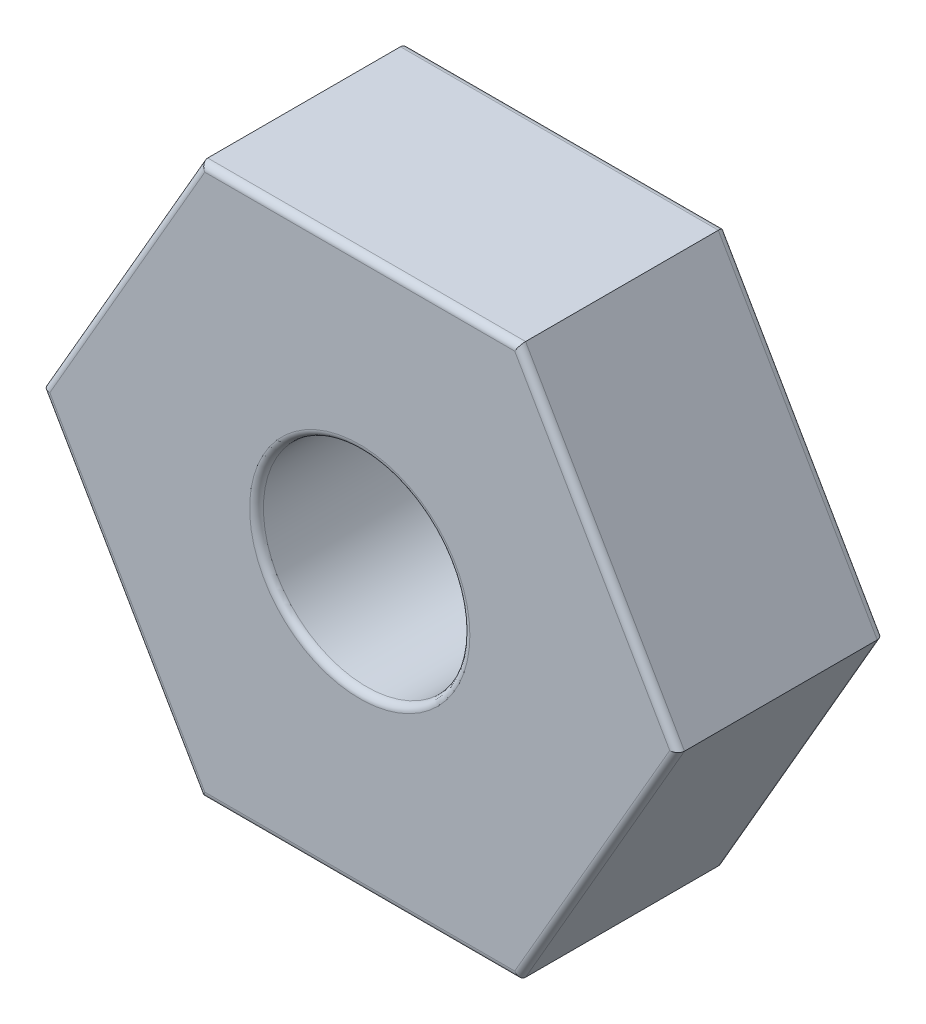
ISO-10303-21;
HEADER;
FILE_DESCRIPTION(('STEP AP214'),'2;1');
FILE_NAME('part.step','',(''),(''),'','','');
FILE_SCHEMA(('AUTOMOTIVE_DESIGN { 1 0 10303 214 1 1 1 1 }'));
ENDSEC;
DATA;
#1=APPLICATION_CONTEXT('core data for automotive mechanical design processes');
#2=APPLICATION_PROTOCOL_DEFINITION('international standard','automotive_design',2000,#1);
#3=PRODUCT_CONTEXT('',#1,'mechanical');
#4=PRODUCT('Part','Part','',(#3));
#5=PRODUCT_RELATED_PRODUCT_CATEGORY('part','',(#4));
#6=PRODUCT_DEFINITION_FORMATION('','',#4);
#7=PRODUCT_DEFINITION_CONTEXT('part definition',#1,'design');
#8=PRODUCT_DEFINITION('design','',#6,#7);
#9=PRODUCT_DEFINITION_SHAPE('','',#8);
#10=(LENGTH_UNIT() NAMED_UNIT(*) SI_UNIT(.MILLI.,.METRE.));
#11=(NAMED_UNIT(*) PLANE_ANGLE_UNIT() SI_UNIT($,.RADIAN.));
#12=(NAMED_UNIT(*) SI_UNIT($,.STERADIAN.) SOLID_ANGLE_UNIT());
#13=UNCERTAINTY_MEASURE_WITH_UNIT(LENGTH_MEASURE(1.E-05),#10,'distance_accuracy_value','');
#14=(GEOMETRIC_REPRESENTATION_CONTEXT(3) GLOBAL_UNCERTAINTY_ASSIGNED_CONTEXT((#13)) GLOBAL_UNIT_ASSIGNED_CONTEXT((#10,
#11,#12)) REPRESENTATION_CONTEXT('',''));
#15=CARTESIAN_POINT('',(0.,0.,0.));
#16=DIRECTION('',(0.,0.,1.));
#17=DIRECTION('',(1.,0.,0.));
#18=AXIS2_PLACEMENT_3D('',#15,#16,#17);
#19=CARTESIAN_POINT('',(-2.30940107675851,4.,3.));
#20=DIRECTION('',(0.,0.,1.));
#21=DIRECTION('',(1.,0.,0.));
#22=AXIS2_PLACEMENT_3D('',#19,#20,#21);
#23=PLANE('',#22);
#24=CARTESIAN_POINT('',(0.,0.,3.));
#25=DIRECTION('',(0.,0.,1.));
#26=DIRECTION('',(1.,0.,0.));
#27=AXIS2_PLACEMENT_3D('',#24,#25,#26);
#28=CIRCLE('',#27,1.6);
#29=CARTESIAN_POINT('',(1.6,0.,3.));
#30=VERTEX_POINT('',#29);
#31=EDGE_CURVE('E11',#30,#30,#28,.F.);
#32=ORIENTED_EDGE('',*,*,#31,.T.);
#33=EDGE_LOOP('',(#32));
#34=FACE_BOUND('',#33,.T.);
#35=DIRECTION('',(0.5,0.866025403784439,0.));
#36=VECTOR('',#35,1.);
#37=CARTESIAN_POINT('',(4.53219961313857,0.0500000000000022,3.));
#38=LINE('',#37,#36);
#39=CARTESIAN_POINT('',(2.25166604983954,-3.9,3.));
#40=VERTEX_POINT('',#39);
#41=CARTESIAN_POINT('',(4.50333209967908,0.,3.));
#42=VERTEX_POINT('',#41);
#43=EDGE_CURVE('E50',#40,#42,#38,.T.);
#44=ORIENTED_EDGE('',*,*,#43,.T.);
#45=DIRECTION('',(-0.5,0.866025403784439,0.));
#46=VECTOR('',#45,1.);
#47=CARTESIAN_POINT('',(2.22279853638006,3.95,3.));
#48=LINE('',#47,#46);
#49=CARTESIAN_POINT('',(2.25166604983954,3.9,3.));
#50=VERTEX_POINT('',#49);
#51=EDGE_CURVE('E42',#42,#50,#48,.T.);
#52=ORIENTED_EDGE('',*,*,#51,.T.);
#53=DIRECTION('',(-1.,0.,0.));
#54=VECTOR('',#53,1.);
#55=CARTESIAN_POINT('',(-2.30940107675851,3.9,3.));
#56=LINE('',#55,#54);
#57=CARTESIAN_POINT('',(-2.25166604983954,3.9,3.));
#58=VERTEX_POINT('',#57);
#59=EDGE_CURVE('E189',#50,#58,#56,.T.);
#60=ORIENTED_EDGE('',*,*,#59,.T.);
#61=DIRECTION('',(-0.5,-0.866025403784439,0.));
#62=VECTOR('',#61,1.);
#63=CARTESIAN_POINT('',(-4.53219961313857,-0.0500000000000032,3.));
#64=LINE('',#63,#62);
#65=CARTESIAN_POINT('',(-4.50333209967908,0.,3.));
#66=VERTEX_POINT('',#65);
#67=EDGE_CURVE('E191',#58,#66,#64,.T.);
#68=ORIENTED_EDGE('',*,*,#67,.T.);
#69=DIRECTION('',(0.5,-0.866025403784439,0.));
#70=VECTOR('',#69,1.);
#71=CARTESIAN_POINT('',(-2.22279853638006,-3.95,3.));
#72=LINE('',#71,#70);
#73=CARTESIAN_POINT('',(-2.25166604983954,-3.9,3.));
#74=VERTEX_POINT('',#73);
#75=EDGE_CURVE('E193',#66,#74,#72,.T.);
#76=ORIENTED_EDGE('',*,*,#75,.T.);
#77=DIRECTION('',(1.,0.,0.));
#78=VECTOR('',#77,1.);
#79=CARTESIAN_POINT('',(2.3094010767585,-3.9,3.));
#80=LINE('',#79,#78);
#81=EDGE_CURVE('E55',#74,#40,#80,.T.);
#82=ORIENTED_EDGE('',*,*,#81,.T.);
#83=EDGE_LOOP('',(#44,#52,#60,#68,#76,#82));
#84=FACE_BOUND('',#83,.T.);
#85=ADVANCED_FACE('F33',(#34,#84),#23,.T.);
#86=CARTESIAN_POINT('',(-2.30940107675851,4.,0.));
#87=DIRECTION('',(0.,0.,1.));
#88=DIRECTION('',(1.,0.,0.));
#89=AXIS2_PLACEMENT_3D('',#86,#87,#88);
#90=PLANE('',#89);
#91=CARTESIAN_POINT('',(0.,0.,0.));
#92=DIRECTION('',(0.,0.,1.));
#93=DIRECTION('',(1.,0.,0.));
#94=AXIS2_PLACEMENT_3D('',#91,#92,#93);
#95=CIRCLE('',#94,1.6);
#96=CARTESIAN_POINT('',(1.6,0.,0.));
#97=VERTEX_POINT('',#96);
#98=EDGE_CURVE('E151',#97,#97,#95,.T.);
#99=ORIENTED_EDGE('',*,*,#98,.T.);
#100=EDGE_LOOP('',(#99));
#101=FACE_BOUND('',#100,.T.);
#102=DIRECTION('',(0.5,-0.866025403784439,0.));
#103=VECTOR('',#102,1.);
#104=CARTESIAN_POINT('',(-5.68690015151782,2.05,0.));
#105=LINE('',#104,#103);
#106=CARTESIAN_POINT('',(-2.25166604983954,-3.9,0.));
#107=VERTEX_POINT('',#106);
#108=CARTESIAN_POINT('',(-4.50333209967908,0.,0.));
#109=VERTEX_POINT('',#108);
#110=EDGE_CURVE('E150',#107,#109,#105,.F.);
#111=ORIENTED_EDGE('',*,*,#110,.T.);
#112=DIRECTION('',(-0.5,-0.866025403784439,0.));
#113=VECTOR('',#112,1.);
#114=CARTESIAN_POINT('',(-2.22279853638006,3.95,0.));
#115=LINE('',#114,#113);
#116=CARTESIAN_POINT('',(-2.25166604983954,3.9,0.));
#117=VERTEX_POINT('',#116);
#118=EDGE_CURVE('E129',#109,#117,#115,.F.);
#119=ORIENTED_EDGE('',*,*,#118,.T.);
#120=DIRECTION('',(-1.,0.,0.));
#121=VECTOR('',#120,1.);
#122=CARTESIAN_POINT('',(-2.30940107675851,3.9,0.));
#123=LINE('',#122,#121);
#124=CARTESIAN_POINT('',(2.25166604983954,3.9,0.));
#125=VERTEX_POINT('',#124);
#126=EDGE_CURVE('E139',#117,#125,#123,.F.);
#127=ORIENTED_EDGE('',*,*,#126,.T.);
#128=DIRECTION('',(-0.5,0.866025403784439,0.));
#129=VECTOR('',#128,1.);
#130=CARTESIAN_POINT('',(1.06809799800081,5.95,0.));
#131=LINE('',#130,#129);
#132=CARTESIAN_POINT('',(4.50333209967908,0.,0.));
#133=VERTEX_POINT('',#132);
#134=EDGE_CURVE('E145',#125,#133,#131,.F.);
#135=ORIENTED_EDGE('',*,*,#134,.T.);
#136=DIRECTION('',(0.5,0.866025403784439,0.));
#137=VECTOR('',#136,1.);
#138=CARTESIAN_POINT('',(4.53219961313856,0.0500000000000006,0.));
#139=LINE('',#138,#137);
#140=CARTESIAN_POINT('',(2.25166604983954,-3.9,0.));
#141=VERTEX_POINT('',#140);
#142=EDGE_CURVE('E251',#133,#141,#139,.F.);
#143=ORIENTED_EDGE('',*,*,#142,.T.);
#144=DIRECTION('',(1.,0.,0.));
#145=VECTOR('',#144,1.);
#146=CARTESIAN_POINT('',(-2.3094010767585,-3.9,0.));
#147=LINE('',#146,#145);
#148=EDGE_CURVE('E156',#141,#107,#147,.F.);
#149=ORIENTED_EDGE('',*,*,#148,.T.);
#150=EDGE_LOOP('',(#111,#119,#127,#135,#143,#149));
#151=FACE_BOUND('',#150,.T.);
#152=ADVANCED_FACE('F148',(#101,#151),#90,.F.);
#153=CARTESIAN_POINT('',(2.3094010767585,4.,3.));
#154=DIRECTION('',(0.,-1.,0.));
#155=DIRECTION('',(1.,0.,0.));
#156=AXIS2_PLACEMENT_3D('',#153,#154,#155);
#157=PLANE('',#156);
#158=DIRECTION('',(0.,0.,-1.));
#159=VECTOR('',#158,1.);
#160=CARTESIAN_POINT('',(2.3094010767585,4.,3.));
#161=LINE('',#160,#159);
#162=CARTESIAN_POINT('',(2.3094010767585,4.,2.9));
#163=VERTEX_POINT('',#162);
#164=CARTESIAN_POINT('',(2.3094010767585,4.,0.1));
#165=VERTEX_POINT('',#164);
#166=EDGE_CURVE('E208',#163,#165,#161,.T.);
#167=ORIENTED_EDGE('',*,*,#166,.T.);
#168=DIRECTION('',(-1.,0.,0.));
#169=VECTOR('',#168,1.);
#170=CARTESIAN_POINT('',(2.3094010767585,4.,0.0999999999999998));
#171=LINE('',#170,#169);
#172=CARTESIAN_POINT('',(-2.30940107675851,4.,0.0999999999999998));
#173=VERTEX_POINT('',#172);
#174=EDGE_CURVE('E187',#165,#173,#171,.T.);
#175=ORIENTED_EDGE('',*,*,#174,.T.);
#176=DIRECTION('',(0.,0.,-1.));
#177=VECTOR('',#176,1.);
#178=CARTESIAN_POINT('',(-2.30940107675851,4.,3.));
#179=LINE('',#178,#177);
#180=CARTESIAN_POINT('',(-2.30940107675851,4.,2.9));
#181=VERTEX_POINT('',#180);
#182=EDGE_CURVE('E146',#181,#173,#179,.T.);
#183=ORIENTED_EDGE('',*,*,#182,.F.);
#184=DIRECTION('',(-1.,0.,0.));
#185=VECTOR('',#184,1.);
#186=CARTESIAN_POINT('',(2.3094010767585,4.,2.9));
#187=LINE('',#186,#185);
#188=EDGE_CURVE('E185',#181,#163,#187,.F.);
#189=ORIENTED_EDGE('',*,*,#188,.T.);
#190=EDGE_LOOP('',(#167,#175,#183,#189));
#191=FACE_BOUND('',#190,.T.);
#192=ADVANCED_FACE('F275',(#191),#157,.F.);
#193=CARTESIAN_POINT('',(-2.30940107675851,4.,3.));
#194=DIRECTION('',(0.866025403784439,-0.5,0.));
#195=DIRECTION('',(0.5,0.866025403784439,0.));
#196=AXIS2_PLACEMENT_3D('',#193,#194,#195);
#197=PLANE('',#196);
#198=ORIENTED_EDGE('',*,*,#182,.T.);
#199=DIRECTION('',(-0.5,-0.866025403784439,0.));
#200=VECTOR('',#199,1.);
#201=CARTESIAN_POINT('',(-2.30940107675851,4.,0.0999999999999998));
#202=LINE('',#201,#200);
#203=CARTESIAN_POINT('',(-4.61880215351701,0.,0.1));
#204=VERTEX_POINT('',#203);
#205=EDGE_CURVE('E132',#173,#204,#202,.T.);
#206=ORIENTED_EDGE('',*,*,#205,.T.);
#207=DIRECTION('',(0.,0.,-1.));
#208=VECTOR('',#207,1.);
#209=CARTESIAN_POINT('',(-4.61880215351701,0.,3.));
#210=LINE('',#209,#208);
#211=CARTESIAN_POINT('',(-4.61880215351701,0.,2.9));
#212=VERTEX_POINT('',#211);
#213=EDGE_CURVE('E237',#212,#204,#210,.T.);
#214=ORIENTED_EDGE('',*,*,#213,.F.);
#215=DIRECTION('',(-0.5,-0.866025403784439,0.));
#216=VECTOR('',#215,1.);
#217=CARTESIAN_POINT('',(-2.30940107675851,4.,2.9));
#218=LINE('',#217,#216);
#219=EDGE_CURVE('E165',#212,#181,#218,.F.);
#220=ORIENTED_EDGE('',*,*,#219,.T.);
#221=EDGE_LOOP('',(#198,#206,#214,#220));
#222=FACE_BOUND('',#221,.T.);
#223=ADVANCED_FACE('F242',(#222),#197,.F.);
#224=CARTESIAN_POINT('',(-4.61880215351701,0.,3.));
#225=DIRECTION('',(0.866025403784438,0.5,0.));
#226=DIRECTION('',(-0.5,0.866025403784439,0.));
#227=AXIS2_PLACEMENT_3D('',#224,#225,#226);
#228=PLANE('',#227);
#229=ORIENTED_EDGE('',*,*,#213,.T.);
#230=DIRECTION('',(0.5,-0.866025403784439,0.));
#231=VECTOR('',#230,1.);
#232=CARTESIAN_POINT('',(-4.61880215351701,0.,0.0999999999999998));
#233=LINE('',#232,#231);
#234=CARTESIAN_POINT('',(-2.3094010767585,-4.,0.1));
#235=VERTEX_POINT('',#234);
#236=EDGE_CURVE('E170',#204,#235,#233,.T.);
#237=ORIENTED_EDGE('',*,*,#236,.T.);
#238=DIRECTION('',(0.,0.,-1.));
#239=VECTOR('',#238,1.);
#240=CARTESIAN_POINT('',(-2.3094010767585,-4.,3.));
#241=LINE('',#240,#239);
#242=CARTESIAN_POINT('',(-2.3094010767585,-4.,2.9));
#243=VERTEX_POINT('',#242);
#244=EDGE_CURVE('E239',#243,#235,#241,.T.);
#245=ORIENTED_EDGE('',*,*,#244,.F.);
#246=DIRECTION('',(0.5,-0.866025403784439,0.));
#247=VECTOR('',#246,1.);
#248=CARTESIAN_POINT('',(-4.61880215351701,0.,2.9));
#249=LINE('',#248,#247);
#250=EDGE_CURVE('E168',#243,#212,#249,.F.);
#251=ORIENTED_EDGE('',*,*,#250,.T.);
#252=EDGE_LOOP('',(#229,#237,#245,#251));
#253=FACE_BOUND('',#252,.T.);
#254=ADVANCED_FACE('F236',(#253),#228,.F.);
#255=CARTESIAN_POINT('',(-2.3094010767585,-4.,3.));
#256=DIRECTION('',(0.,1.,0.));
#257=DIRECTION('',(-1.,0.,0.));
#258=AXIS2_PLACEMENT_3D('',#255,#256,#257);
#259=PLANE('',#258);
#260=ORIENTED_EDGE('',*,*,#244,.T.);
#261=DIRECTION('',(1.,0.,0.));
#262=VECTOR('',#261,1.);
#263=CARTESIAN_POINT('',(-2.3094010767585,-4.,0.0999999999999998));
#264=LINE('',#263,#262);
#265=CARTESIAN_POINT('',(2.3094010767585,-4.,0.1));
#266=VERTEX_POINT('',#265);
#267=EDGE_CURVE('E174',#235,#266,#264,.T.);
#268=ORIENTED_EDGE('',*,*,#267,.T.);
#269=DIRECTION('',(0.,0.,-1.));
#270=VECTOR('',#269,1.);
#271=CARTESIAN_POINT('',(2.3094010767585,-4.,3.));
#272=LINE('',#271,#270);
#273=CARTESIAN_POINT('',(2.3094010767585,-4.,2.9));
#274=VERTEX_POINT('',#273);
#275=EDGE_CURVE('E246',#274,#266,#272,.T.);
#276=ORIENTED_EDGE('',*,*,#275,.F.);
#277=DIRECTION('',(1.,0.,0.));
#278=VECTOR('',#277,1.);
#279=CARTESIAN_POINT('',(-2.3094010767585,-4.,2.9));
#280=LINE('',#279,#278);
#281=EDGE_CURVE('E172',#274,#243,#280,.F.);
#282=ORIENTED_EDGE('',*,*,#281,.T.);
#283=EDGE_LOOP('',(#260,#268,#276,#282));
#284=FACE_BOUND('',#283,.T.);
#285=ADVANCED_FACE('F263',(#284),#259,.F.);
#286=CARTESIAN_POINT('',(2.3094010767585,-4.,3.));
#287=DIRECTION('',(-0.866025403784439,0.5,0.));
#288=DIRECTION('',(-0.5,-0.866025403784439,0.));
#289=AXIS2_PLACEMENT_3D('',#286,#287,#288);
#290=PLANE('',#289);
#291=ORIENTED_EDGE('',*,*,#275,.T.);
#292=DIRECTION('',(0.5,0.866025403784439,0.));
#293=VECTOR('',#292,1.);
#294=CARTESIAN_POINT('',(2.3094010767585,-4.,0.0999999999999998));
#295=LINE('',#294,#293);
#296=CARTESIAN_POINT('',(4.61880215351701,0.,0.1));
#297=VERTEX_POINT('',#296);
#298=EDGE_CURVE('E178',#266,#297,#295,.T.);
#299=ORIENTED_EDGE('',*,*,#298,.T.);
#300=DIRECTION('',(0.,0.,-1.));
#301=VECTOR('',#300,1.);
#302=CARTESIAN_POINT('',(4.61880215351701,0.,3.));
#303=LINE('',#302,#301);
#304=CARTESIAN_POINT('',(4.61880215351701,0.,2.9));
#305=VERTEX_POINT('',#304);
#306=EDGE_CURVE('E268',#305,#297,#303,.T.);
#307=ORIENTED_EDGE('',*,*,#306,.F.);
#308=DIRECTION('',(0.5,0.866025403784439,0.));
#309=VECTOR('',#308,1.);
#310=CARTESIAN_POINT('',(2.3094010767585,-4.,2.9));
#311=LINE('',#310,#309);
#312=EDGE_CURVE('E176',#305,#274,#311,.F.);
#313=ORIENTED_EDGE('',*,*,#312,.T.);
#314=EDGE_LOOP('',(#291,#299,#307,#313));
#315=FACE_BOUND('',#314,.T.);
#316=ADVANCED_FACE('F286',(#315),#290,.F.);
#317=CARTESIAN_POINT('',(4.61880215351701,0.,3.));
#318=DIRECTION('',(-0.866025403784439,-0.5,0.));
#319=DIRECTION('',(0.5,-0.866025403784439,0.));
#320=AXIS2_PLACEMENT_3D('',#317,#318,#319);
#321=PLANE('',#320);
#322=ORIENTED_EDGE('',*,*,#306,.T.);
#323=DIRECTION('',(-0.5,0.866025403784439,0.));
#324=VECTOR('',#323,1.);
#325=CARTESIAN_POINT('',(4.61880215351701,0.,0.0999999999999998));
#326=LINE('',#325,#324);
#327=EDGE_CURVE('E183',#297,#165,#326,.T.);
#328=ORIENTED_EDGE('',*,*,#327,.T.);
#329=ORIENTED_EDGE('',*,*,#166,.F.);
#330=DIRECTION('',(-0.5,0.866025403784439,0.));
#331=VECTOR('',#330,1.);
#332=CARTESIAN_POINT('',(4.61880215351701,0.,2.9));
#333=LINE('',#332,#331);
#334=EDGE_CURVE('E180',#163,#305,#333,.F.);
#335=ORIENTED_EDGE('',*,*,#334,.T.);
#336=EDGE_LOOP('',(#322,#328,#329,#335));
#337=FACE_BOUND('',#336,.T.);
#338=ADVANCED_FACE('F287',(#337),#321,.F.);
#339=CARTESIAN_POINT('',(0.,0.,3.));
#340=DIRECTION('',(0.,0.,-1.));
#341=DIRECTION('',(-1.,0.,0.));
#342=AXIS2_PLACEMENT_3D('',#339,#340,#341);
#343=CYLINDRICAL_SURFACE('',#342,1.5);
#344=CARTESIAN_POINT('',(0.,0.,0.0999999999999998));
#345=DIRECTION('',(0.,0.,1.));
#346=DIRECTION('',(1.,0.,0.));
#347=AXIS2_PLACEMENT_3D('',#344,#345,#346);
#348=CIRCLE('',#347,1.5);
#349=CARTESIAN_POINT('',(1.5,0.,0.0999999999999998));
#350=VERTEX_POINT('',#349);
#351=EDGE_CURVE('E162',#350,#350,#348,.F.);
#352=ORIENTED_EDGE('',*,*,#351,.T.);
#353=EDGE_LOOP('',(#352));
#354=FACE_BOUND('',#353,.T.);
#355=CARTESIAN_POINT('',(0.,0.,2.9));
#356=DIRECTION('',(0.,0.,1.));
#357=DIRECTION('',(1.,0.,0.));
#358=AXIS2_PLACEMENT_3D('',#355,#356,#357);
#359=CIRCLE('',#358,1.5);
#360=CARTESIAN_POINT('',(1.5,0.,2.9));
#361=VERTEX_POINT('',#360);
#362=EDGE_CURVE('E154',#361,#361,#359,.T.);
#363=ORIENTED_EDGE('',*,*,#362,.T.);
#364=EDGE_LOOP('',(#363));
#365=FACE_BOUND('',#364,.T.);
#366=ADVANCED_FACE('F306',(#354,#365),#343,.F.);
#367=CARTESIAN_POINT('',(0.,0.,0.0999999999999998));
#368=DIRECTION('',(0.,0.,1.));
#369=DIRECTION('',(1.,0.,0.));
#370=AXIS2_PLACEMENT_3D('',#367,#368,#369);
#371=TOROIDAL_SURFACE('',#370,1.6,0.1);
#372=ORIENTED_EDGE('',*,*,#351,.F.);
#373=EDGE_LOOP('',(#372));
#374=FACE_BOUND('',#373,.T.);
#375=ORIENTED_EDGE('',*,*,#98,.F.);
#376=EDGE_LOOP('',(#375));
#377=FACE_BOUND('',#376,.T.);
#378=ADVANCED_FACE('F320',(#374,#377),#371,.T.);
#379=CARTESIAN_POINT('',(2.22279853638006,-3.95,0.0999999999999998));
#380=DIRECTION('',(0.5,0.866025403784439,0.));
#381=DIRECTION('',(-0.866025403784439,0.5,0.));
#382=AXIS2_PLACEMENT_3D('',#379,#380,#381);
#383=CYLINDRICAL_SURFACE('',#382,0.1);
#384=CARTESIAN_POINT('',(2.25166604983954,-3.9,0.0999999999999998));
#385=DIRECTION('',(0.866025403784438,0.5,0.));
#386=DIRECTION('',(-0.5,0.866025403784438,0.));
#387=AXIS2_PLACEMENT_3D('',#384,#385,#386);
#388=ELLIPSE('',#387,0.115470053837925,0.1);
#389=EDGE_CURVE('E202',#141,#266,#388,.F.);
#390=ORIENTED_EDGE('',*,*,#389,.F.);
#391=ORIENTED_EDGE('',*,*,#142,.F.);
#392=CARTESIAN_POINT('',(4.50333209967908,0.,0.0999999999999998));
#393=DIRECTION('',(0.,1.,0.));
#394=DIRECTION('',(-1.,0.,0.));
#395=AXIS2_PLACEMENT_3D('',#392,#393,#394);
#396=ELLIPSE('',#395,0.115470053837925,0.1);
#397=EDGE_CURVE('E205',#297,#133,#396,.T.);
#398=ORIENTED_EDGE('',*,*,#397,.F.);
#399=ORIENTED_EDGE('',*,*,#298,.F.);
#400=EDGE_LOOP('',(#390,#391,#398,#399));
#401=FACE_BOUND('',#400,.T.);
#402=ADVANCED_FACE('F284',(#401),#383,.T.);
#403=CARTESIAN_POINT('',(4.53219961313856,-0.0499999999999974,0.0999999999999998));
#404=DIRECTION('',(-0.5,0.866025403784439,0.));
#405=DIRECTION('',(-0.866025403784439,-0.5,0.));
#406=AXIS2_PLACEMENT_3D('',#403,#404,#405);
#407=CYLINDRICAL_SURFACE('',#406,0.1);
#408=ORIENTED_EDGE('',*,*,#397,.T.);
#409=ORIENTED_EDGE('',*,*,#134,.F.);
#410=CARTESIAN_POINT('',(2.25166604983954,3.9,0.0999999999999998));
#411=DIRECTION('',(-0.866025403784439,0.5,0.));
#412=DIRECTION('',(-0.5,-0.866025403784439,0.));
#413=AXIS2_PLACEMENT_3D('',#410,#411,#412);
#414=ELLIPSE('',#413,0.115470053837925,0.1);
#415=EDGE_CURVE('E142',#165,#125,#414,.T.);
#416=ORIENTED_EDGE('',*,*,#415,.F.);
#417=ORIENTED_EDGE('',*,*,#327,.F.);
#418=EDGE_LOOP('',(#408,#409,#416,#417));
#419=FACE_BOUND('',#418,.T.);
#420=ADVANCED_FACE('F281',(#419),#407,.T.);
#421=CARTESIAN_POINT('',(-2.3094010767585,-3.9,0.0999999999999998));
#422=DIRECTION('',(1.,0.,0.));
#423=DIRECTION('',(0.,1.,0.));
#424=AXIS2_PLACEMENT_3D('',#421,#422,#423);
#425=CYLINDRICAL_SURFACE('',#424,0.1);
#426=ORIENTED_EDGE('',*,*,#389,.T.);
#427=ORIENTED_EDGE('',*,*,#267,.F.);
#428=CARTESIAN_POINT('',(-2.25166604983954,-3.9,0.0999999999999998));
#429=DIRECTION('',(0.866025403784439,-0.5,0.));
#430=DIRECTION('',(0.5,0.866025403784439,0.));
#431=AXIS2_PLACEMENT_3D('',#428,#429,#430);
#432=ELLIPSE('',#431,0.115470053837925,0.1);
#433=EDGE_CURVE('E135',#107,#235,#432,.F.);
#434=ORIENTED_EDGE('',*,*,#433,.F.);
#435=ORIENTED_EDGE('',*,*,#148,.F.);
#436=EDGE_LOOP('',(#426,#427,#434,#435));
#437=FACE_BOUND('',#436,.T.);
#438=ADVANCED_FACE('F258',(#437),#425,.T.);
#439=CARTESIAN_POINT('',(2.3094010767585,3.9,0.0999999999999998));
#440=DIRECTION('',(-1.,0.,0.));
#441=DIRECTION('',(0.,-1.,0.));
#442=AXIS2_PLACEMENT_3D('',#439,#440,#441);
#443=CYLINDRICAL_SURFACE('',#442,0.1);
#444=ORIENTED_EDGE('',*,*,#415,.T.);
#445=ORIENTED_EDGE('',*,*,#126,.F.);
#446=CARTESIAN_POINT('',(-2.25166604983954,3.9,0.0999999999999998));
#447=DIRECTION('',(-0.866025403784438,-0.5,0.));
#448=DIRECTION('',(-0.5,0.866025403784439,0.));
#449=AXIS2_PLACEMENT_3D('',#446,#447,#448);
#450=ELLIPSE('',#449,0.115470053837925,0.1);
#451=EDGE_CURVE('E125',#173,#117,#450,.T.);
#452=ORIENTED_EDGE('',*,*,#451,.F.);
#453=ORIENTED_EDGE('',*,*,#174,.F.);
#454=EDGE_LOOP('',(#444,#445,#452,#453));
#455=FACE_BOUND('',#454,.T.);
#456=ADVANCED_FACE('F140',(#455),#443,.T.);
#457=CARTESIAN_POINT('',(-4.53219961313856,0.049999999999998,0.0999999999999998));
#458=DIRECTION('',(0.5,-0.866025403784439,0.));
#459=DIRECTION('',(0.866025403784439,0.5,0.));
#460=AXIS2_PLACEMENT_3D('',#457,#458,#459);
#461=CYLINDRICAL_SURFACE('',#460,0.1);
#462=ORIENTED_EDGE('',*,*,#433,.T.);
#463=ORIENTED_EDGE('',*,*,#236,.F.);
#464=CARTESIAN_POINT('',(-4.50333209967908,0.,0.0999999999999998));
#465=DIRECTION('',(0.,-1.,0.));
#466=DIRECTION('',(1.,0.,0.));
#467=AXIS2_PLACEMENT_3D('',#464,#465,#466);
#468=ELLIPSE('',#467,0.115470053837925,0.1);
#469=EDGE_CURVE('E136',#109,#204,#468,.F.);
#470=ORIENTED_EDGE('',*,*,#469,.F.);
#471=ORIENTED_EDGE('',*,*,#110,.F.);
#472=EDGE_LOOP('',(#462,#463,#470,#471));
#473=FACE_BOUND('',#472,.T.);
#474=ADVANCED_FACE('F261',(#473),#461,.T.);
#475=CARTESIAN_POINT('',(-2.22279853638006,3.95,0.0999999999999998));
#476=DIRECTION('',(-0.5,-0.866025403784439,0.));
#477=DIRECTION('',(0.866025403784439,-0.5,0.));
#478=AXIS2_PLACEMENT_3D('',#475,#476,#477);
#479=CYLINDRICAL_SURFACE('',#478,0.1);
#480=ORIENTED_EDGE('',*,*,#451,.T.);
#481=ORIENTED_EDGE('',*,*,#118,.F.);
#482=ORIENTED_EDGE('',*,*,#469,.T.);
#483=ORIENTED_EDGE('',*,*,#205,.F.);
#484=EDGE_LOOP('',(#480,#481,#482,#483));
#485=FACE_BOUND('',#484,.T.);
#486=ADVANCED_FACE('F127',(#485),#479,.T.);
#487=CARTESIAN_POINT('',(0.,0.,2.9));
#488=DIRECTION('',(0.,0.,1.));
#489=DIRECTION('',(1.,0.,0.));
#490=AXIS2_PLACEMENT_3D('',#487,#488,#489);
#491=TOROIDAL_SURFACE('',#490,1.6,0.1);
#492=ORIENTED_EDGE('',*,*,#31,.F.);
#493=EDGE_LOOP('',(#492));
#494=FACE_BOUND('',#493,.T.);
#495=ORIENTED_EDGE('',*,*,#362,.F.);
#496=EDGE_LOOP('',(#495));
#497=FACE_BOUND('',#496,.T.);
#498=ADVANCED_FACE('F326',(#494,#497),#491,.T.);
#499=CARTESIAN_POINT('',(-5.68690015151782,2.05,2.9));
#500=DIRECTION('',(-0.5,0.866025403784439,0.));
#501=DIRECTION('',(-0.866025403784439,-0.5,0.));
#502=AXIS2_PLACEMENT_3D('',#499,#500,#501);
#503=CYLINDRICAL_SURFACE('',#502,0.1);
#504=CARTESIAN_POINT('',(-4.50333209967908,0.,2.9));
#505=DIRECTION('',(0.,1.,0.));
#506=DIRECTION('',(1.,0.,0.));
#507=AXIS2_PLACEMENT_3D('',#504,#505,#506);
#508=ELLIPSE('',#507,0.115470053837925,0.1);
#509=EDGE_CURVE('E218',#212,#66,#508,.T.);
#510=ORIENTED_EDGE('',*,*,#509,.F.);
#511=ORIENTED_EDGE('',*,*,#250,.F.);
#512=CARTESIAN_POINT('',(-2.25166604983954,-3.9,2.9));
#513=DIRECTION('',(-0.866025403784439,0.5,0.));
#514=DIRECTION('',(0.5,0.866025403784439,0.));
#515=AXIS2_PLACEMENT_3D('',#512,#513,#514);
#516=ELLIPSE('',#515,0.115470053837925,0.1);
#517=EDGE_CURVE('E37',#74,#243,#516,.F.);
#518=ORIENTED_EDGE('',*,*,#517,.F.);
#519=ORIENTED_EDGE('',*,*,#75,.F.);
#520=EDGE_LOOP('',(#510,#511,#518,#519));
#521=FACE_BOUND('',#520,.T.);
#522=ADVANCED_FACE('F35',(#521),#503,.T.);
#523=CARTESIAN_POINT('',(-2.3094010767585,-3.9,2.9));
#524=DIRECTION('',(-1.,0.,0.));
#525=DIRECTION('',(0.,-1.,0.));
#526=AXIS2_PLACEMENT_3D('',#523,#524,#525);
#527=CYLINDRICAL_SURFACE('',#526,0.1);
#528=ORIENTED_EDGE('',*,*,#517,.T.);
#529=ORIENTED_EDGE('',*,*,#281,.F.);
#530=CARTESIAN_POINT('',(2.25166604983954,-3.9,2.9));
#531=DIRECTION('',(-0.866025403784438,-0.5,0.));
#532=DIRECTION('',(-0.5,0.866025403784438,0.));
#533=AXIS2_PLACEMENT_3D('',#530,#531,#532);
#534=ELLIPSE('',#533,0.115470053837925,0.1);
#535=EDGE_CURVE('E216',#40,#274,#534,.F.);
#536=ORIENTED_EDGE('',*,*,#535,.F.);
#537=ORIENTED_EDGE('',*,*,#81,.F.);
#538=EDGE_LOOP('',(#528,#529,#536,#537));
#539=FACE_BOUND('',#538,.T.);
#540=ADVANCED_FACE('F228',(#539),#527,.T.);
#541=CARTESIAN_POINT('',(-2.22279853638006,3.95,2.9));
#542=DIRECTION('',(0.5,0.866025403784439,0.));
#543=DIRECTION('',(-0.866025403784439,0.5,0.));
#544=AXIS2_PLACEMENT_3D('',#541,#542,#543);
#545=CYLINDRICAL_SURFACE('',#544,0.1);
#546=ORIENTED_EDGE('',*,*,#509,.T.);
#547=ORIENTED_EDGE('',*,*,#67,.F.);
#548=CARTESIAN_POINT('',(-2.25166604983954,3.9,2.9));
#549=DIRECTION('',(0.866025403784438,0.5,0.));
#550=DIRECTION('',(0.5,-0.866025403784439,0.));
#551=AXIS2_PLACEMENT_3D('',#548,#549,#550);
#552=ELLIPSE('',#551,0.115470053837925,0.1);
#553=EDGE_CURVE('E213',#181,#58,#552,.T.);
#554=ORIENTED_EDGE('',*,*,#553,.F.);
#555=ORIENTED_EDGE('',*,*,#219,.F.);
#556=EDGE_LOOP('',(#546,#547,#554,#555));
#557=FACE_BOUND('',#556,.T.);
#558=ADVANCED_FACE('F347',(#557),#545,.T.);
#559=CARTESIAN_POINT('',(4.53219961313856,0.0500000000000006,2.9));
#560=DIRECTION('',(-0.5,-0.866025403784439,0.));
#561=DIRECTION('',(0.866025403784439,-0.5,0.));
#562=AXIS2_PLACEMENT_3D('',#559,#560,#561);
#563=CYLINDRICAL_SURFACE('',#562,0.1);
#564=ORIENTED_EDGE('',*,*,#535,.T.);
#565=ORIENTED_EDGE('',*,*,#312,.F.);
#566=CARTESIAN_POINT('',(4.50333209967908,0.,2.9));
#567=DIRECTION('',(0.,-1.,0.));
#568=DIRECTION('',(-1.,0.,0.));
#569=AXIS2_PLACEMENT_3D('',#566,#567,#568);
#570=ELLIPSE('',#569,0.115470053837925,0.1);
#571=EDGE_CURVE('E211',#42,#305,#570,.F.);
#572=ORIENTED_EDGE('',*,*,#571,.F.);
#573=ORIENTED_EDGE('',*,*,#43,.F.);
#574=EDGE_LOOP('',(#564,#565,#572,#573));
#575=FACE_BOUND('',#574,.T.);
#576=ADVANCED_FACE('F344',(#575),#563,.T.);
#577=CARTESIAN_POINT('',(-2.30940107675851,3.9,2.9));
#578=DIRECTION('',(1.,0.,0.));
#579=DIRECTION('',(0.,1.,0.));
#580=AXIS2_PLACEMENT_3D('',#577,#578,#579);
#581=CYLINDRICAL_SURFACE('',#580,0.1);
#582=ORIENTED_EDGE('',*,*,#553,.T.);
#583=ORIENTED_EDGE('',*,*,#59,.F.);
#584=CARTESIAN_POINT('',(2.25166604983954,3.9,2.9));
#585=DIRECTION('',(0.866025403784439,-0.5,0.));
#586=DIRECTION('',(0.5,0.866025403784439,0.));
#587=AXIS2_PLACEMENT_3D('',#584,#585,#586);
#588=ELLIPSE('',#587,0.115470053837925,0.1);
#589=EDGE_CURVE('E209',#163,#50,#588,.T.);
#590=ORIENTED_EDGE('',*,*,#589,.F.);
#591=ORIENTED_EDGE('',*,*,#188,.F.);
#592=EDGE_LOOP('',(#582,#583,#590,#591));
#593=FACE_BOUND('',#592,.T.);
#594=ADVANCED_FACE('F295',(#593),#581,.T.);
#595=CARTESIAN_POINT('',(1.06809799800081,5.95,2.9));
#596=DIRECTION('',(0.5,-0.866025403784439,0.));
#597=DIRECTION('',(0.866025403784439,0.5,0.));
#598=AXIS2_PLACEMENT_3D('',#595,#596,#597);
#599=CYLINDRICAL_SURFACE('',#598,0.1);
#600=ORIENTED_EDGE('',*,*,#571,.T.);
#601=ORIENTED_EDGE('',*,*,#334,.F.);
#602=ORIENTED_EDGE('',*,*,#589,.T.);
#603=ORIENTED_EDGE('',*,*,#51,.F.);
#604=EDGE_LOOP('',(#600,#601,#602,#603));
#605=FACE_BOUND('',#604,.T.);
#606=ADVANCED_FACE('F290',(#605),#599,.T.);
#607=CLOSED_SHELL('',(#85,#152,#192,#223,#254,#285,#316,#338,#366,#378,#402,#420,#438,#456,#474,
#486,#498,#522,#540,#558,#576,#594,#606));
#608=MANIFOLD_SOLID_BREP('B2',#607);
#609=ADVANCED_BREP_SHAPE_REPRESENTATION('',(#18,#608),#14);
#610=SHAPE_DEFINITION_REPRESENTATION(#9,#609);
ENDSEC;
END-ISO-10303-21;
